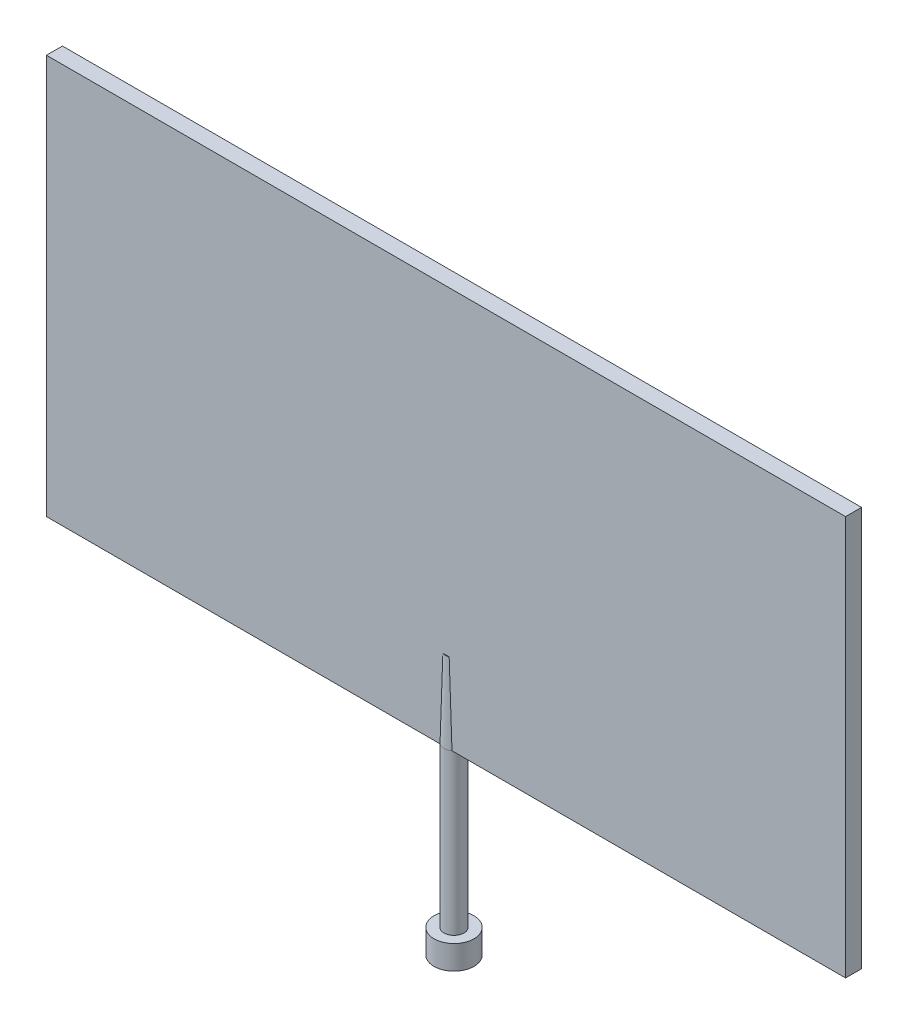
ISO-10303-21;
HEADER;
FILE_DESCRIPTION(('STEP AP214'),'2;1');
FILE_NAME('part.step','',(''),(''),'','','');
FILE_SCHEMA(('AUTOMOTIVE_DESIGN { 1 0 10303 214 1 1 1 1 }'));
ENDSEC;
DATA;
#1=APPLICATION_CONTEXT('core data for automotive mechanical design processes');
#2=APPLICATION_PROTOCOL_DEFINITION('international standard','automotive_design',2000,#1);
#3=PRODUCT_CONTEXT('',#1,'mechanical');
#4=PRODUCT('Part','Part','',(#3));
#5=PRODUCT_RELATED_PRODUCT_CATEGORY('part','',(#4));
#6=PRODUCT_DEFINITION_FORMATION('','',#4);
#7=PRODUCT_DEFINITION_CONTEXT('part definition',#1,'design');
#8=PRODUCT_DEFINITION('design','',#6,#7);
#9=PRODUCT_DEFINITION_SHAPE('','',#8);
#10=(LENGTH_UNIT() NAMED_UNIT(*) SI_UNIT(.MILLI.,.METRE.));
#11=(NAMED_UNIT(*) PLANE_ANGLE_UNIT() SI_UNIT($,.RADIAN.));
#12=(NAMED_UNIT(*) SI_UNIT($,.STERADIAN.) SOLID_ANGLE_UNIT());
#13=UNCERTAINTY_MEASURE_WITH_UNIT(LENGTH_MEASURE(1.E-05),#10,'distance_accuracy_value','');
#14=(GEOMETRIC_REPRESENTATION_CONTEXT(3) GLOBAL_UNCERTAINTY_ASSIGNED_CONTEXT((#13)) GLOBAL_UNIT_ASSIGNED_CONTEXT((#10,
#11,#12)) REPRESENTATION_CONTEXT('',''));
#15=CARTESIAN_POINT('',(0.,0.,0.));
#16=DIRECTION('',(0.,0.,1.));
#17=DIRECTION('',(1.,0.,0.));
#18=AXIS2_PLACEMENT_3D('',#15,#16,#17);
#19=CARTESIAN_POINT('',(-26.25,-23.,-13.375));
#20=DIRECTION('',(0.,-1.,0.));
#21=DIRECTION('',(0.,0.,-1.));
#22=AXIS2_PLACEMENT_3D('',#19,#20,#21);
#23=PLANE('',#22);
#24=CARTESIAN_POINT('',(-26.25,-23.,-13.375));
#25=DIRECTION('',(0.,-1.,0.));
#26=DIRECTION('',(0.,0.,-1.));
#27=AXIS2_PLACEMENT_3D('',#24,#25,#26);
#28=CIRCLE('',#27,2.49900126422122);
#29=CARTESIAN_POINT('',(-26.25,-23.,-10.8759987357788));
#30=VERTEX_POINT('',#29);
#31=EDGE_CURVE('E11',#30,#30,#28,.T.);
#32=ORIENTED_EDGE('',*,*,#31,.T.);
#33=EDGE_LOOP('',(#32));
#34=FACE_BOUND('',#33,.T.);
#35=CARTESIAN_POINT('',(-26.25,-23.,-13.375));
#36=DIRECTION('',(0.,-1.,0.));
#37=DIRECTION('',(0.,0.,-1.));
#38=AXIS2_PLACEMENT_3D('',#35,#36,#37);
#39=CIRCLE('',#38,1.25);
#40=CARTESIAN_POINT('',(-26.25,-23.,-12.125));
#41=VERTEX_POINT('',#40);
#42=EDGE_CURVE('E52',#41,#41,#39,.T.);
#43=ORIENTED_EDGE('',*,*,#42,.F.);
#44=EDGE_LOOP('',(#43));
#45=FACE_BOUND('',#44,.T.);
#46=ADVANCED_FACE('F41',(#34,#45),#23,.T.);
#47=CARTESIAN_POINT('',(-26.25,-20.,-13.375));
#48=DIRECTION('',(0.,-1.,0.));
#49=DIRECTION('',(0.,0.,-1.));
#50=AXIS2_PLACEMENT_3D('',#47,#48,#49);
#51=PLANE('',#50);
#52=CARTESIAN_POINT('',(-26.25,-20.,-13.375));
#53=DIRECTION('',(0.,-1.,0.));
#54=DIRECTION('',(0.,0.,-1.));
#55=AXIS2_PLACEMENT_3D('',#52,#53,#54);
#56=CIRCLE('',#55,2.49900126422122);
#57=CARTESIAN_POINT('',(-26.25,-20.,-10.8759987357788));
#58=VERTEX_POINT('',#57);
#59=EDGE_CURVE('E45',#58,#58,#56,.T.);
#60=ORIENTED_EDGE('',*,*,#59,.F.);
#61=EDGE_LOOP('',(#60));
#62=FACE_BOUND('',#61,.T.);
#63=CARTESIAN_POINT('',(-26.25,-20.,-13.375));
#64=DIRECTION('',(0.,-1.,0.));
#65=DIRECTION('',(0.,0.,-1.));
#66=AXIS2_PLACEMENT_3D('',#63,#64,#65);
#67=CIRCLE('',#66,1.25);
#68=CARTESIAN_POINT('',(-26.25,-20.,-12.125));
#69=VERTEX_POINT('',#68);
#70=EDGE_CURVE('E54',#69,#69,#67,.T.);
#71=ORIENTED_EDGE('',*,*,#70,.T.);
#72=EDGE_LOOP('',(#71));
#73=FACE_BOUND('',#72,.T.);
#74=ADVANCED_FACE('F64',(#62,#73),#51,.F.);
#75=CARTESIAN_POINT('',(-26.25,-23.,-13.375));
#76=DIRECTION('',(0.,1.,0.));
#77=DIRECTION('',(0.,0.,1.));
#78=AXIS2_PLACEMENT_3D('',#75,#76,#77);
#79=CYLINDRICAL_SURFACE('',#78,2.49900126422122);
#80=CARTESIAN_POINT('',(-26.25,-23.,-10.8759987357788));
#81=CARTESIAN_POINT('',(-26.25,-22.96875,-10.8759987357788));
#82=CARTESIAN_POINT('',(-26.25,-22.9375,-10.8759987357788));
#83=CARTESIAN_POINT('',(-26.25,-22.875,-10.8759987357788));
#84=CARTESIAN_POINT('',(-26.25,-22.84375,-10.8759987357788));
#85=CARTESIAN_POINT('',(-26.25,-22.78125,-10.8759987357788));
#86=CARTESIAN_POINT('',(-26.25,-22.75,-10.8759987357788));
#87=CARTESIAN_POINT('',(-26.25,-22.6875,-10.8759987357788));
#88=CARTESIAN_POINT('',(-26.25,-22.65625,-10.8759987357788));
#89=CARTESIAN_POINT('',(-26.25,-22.59375,-10.8759987357788));
#90=CARTESIAN_POINT('',(-26.25,-22.5625,-10.8759987357788));
#91=CARTESIAN_POINT('',(-26.25,-22.5,-10.8759987357788));
#92=CARTESIAN_POINT('',(-26.25,-22.46875,-10.8759987357788));
#93=CARTESIAN_POINT('',(-26.25,-22.40625,-10.8759987357788));
#94=CARTESIAN_POINT('',(-26.25,-22.375,-10.8759987357788));
#95=CARTESIAN_POINT('',(-26.25,-22.3125,-10.8759987357788));
#96=CARTESIAN_POINT('',(-26.25,-22.28125,-10.8759987357788));
#97=CARTESIAN_POINT('',(-26.25,-22.21875,-10.8759987357788));
#98=CARTESIAN_POINT('',(-26.25,-22.1875,-10.8759987357788));
#99=CARTESIAN_POINT('',(-26.25,-22.125,-10.8759987357788));
#100=CARTESIAN_POINT('',(-26.25,-22.09375,-10.8759987357788));
#101=CARTESIAN_POINT('',(-26.25,-22.03125,-10.8759987357788));
#102=CARTESIAN_POINT('',(-26.25,-22.,-10.8759987357788));
#103=CARTESIAN_POINT('',(-26.25,-21.9375,-10.8759987357788));
#104=CARTESIAN_POINT('',(-26.25,-21.90625,-10.8759987357788));
#105=CARTESIAN_POINT('',(-26.25,-21.84375,-10.8759987357788));
#106=CARTESIAN_POINT('',(-26.25,-21.8125,-10.8759987357788));
#107=CARTESIAN_POINT('',(-26.25,-21.75,-10.8759987357788));
#108=CARTESIAN_POINT('',(-26.25,-21.71875,-10.8759987357788));
#109=CARTESIAN_POINT('',(-26.25,-21.65625,-10.8759987357788));
#110=CARTESIAN_POINT('',(-26.25,-21.625,-10.8759987357788));
#111=CARTESIAN_POINT('',(-26.25,-21.5625,-10.8759987357788));
#112=CARTESIAN_POINT('',(-26.25,-21.53125,-10.8759987357788));
#113=CARTESIAN_POINT('',(-26.25,-21.46875,-10.8759987357788));
#114=CARTESIAN_POINT('',(-26.25,-21.4375,-10.8759987357788));
#115=CARTESIAN_POINT('',(-26.25,-21.375,-10.8759987357788));
#116=CARTESIAN_POINT('',(-26.25,-21.34375,-10.8759987357788));
#117=CARTESIAN_POINT('',(-26.25,-21.28125,-10.8759987357788));
#118=CARTESIAN_POINT('',(-26.25,-21.25,-10.8759987357788));
#119=CARTESIAN_POINT('',(-26.25,-21.1875,-10.8759987357788));
#120=CARTESIAN_POINT('',(-26.25,-21.15625,-10.8759987357788));
#121=CARTESIAN_POINT('',(-26.25,-21.09375,-10.8759987357788));
#122=CARTESIAN_POINT('',(-26.25,-21.0625,-10.8759987357788));
#123=CARTESIAN_POINT('',(-26.25,-21.,-10.8759987357788));
#124=CARTESIAN_POINT('',(-26.25,-20.96875,-10.8759987357788));
#125=CARTESIAN_POINT('',(-26.25,-20.90625,-10.8759987357788));
#126=CARTESIAN_POINT('',(-26.25,-20.875,-10.8759987357788));
#127=CARTESIAN_POINT('',(-26.25,-20.8125,-10.8759987357788));
#128=CARTESIAN_POINT('',(-26.25,-20.78125,-10.8759987357788));
#129=CARTESIAN_POINT('',(-26.25,-20.71875,-10.8759987357788));
#130=CARTESIAN_POINT('',(-26.25,-20.6875,-10.8759987357788));
#131=CARTESIAN_POINT('',(-26.25,-20.625,-10.8759987357788));
#132=CARTESIAN_POINT('',(-26.25,-20.59375,-10.8759987357788));
#133=CARTESIAN_POINT('',(-26.25,-20.53125,-10.8759987357788));
#134=CARTESIAN_POINT('',(-26.25,-20.5,-10.8759987357788));
#135=CARTESIAN_POINT('',(-26.25,-20.4375,-10.8759987357788));
#136=CARTESIAN_POINT('',(-26.25,-20.40625,-10.8759987357788));
#137=CARTESIAN_POINT('',(-26.25,-20.34375,-10.8759987357788));
#138=CARTESIAN_POINT('',(-26.25,-20.3125,-10.8759987357788));
#139=CARTESIAN_POINT('',(-26.25,-20.25,-10.8759987357788));
#140=CARTESIAN_POINT('',(-26.25,-20.21875,-10.8759987357788));
#141=CARTESIAN_POINT('',(-26.25,-20.15625,-10.8759987357788));
#142=CARTESIAN_POINT('',(-26.25,-20.125,-10.8759987357788));
#143=CARTESIAN_POINT('',(-26.25,-20.0625,-10.8759987357788));
#144=CARTESIAN_POINT('',(-26.25,-20.03125,-10.8759987357788));
#145=CARTESIAN_POINT('',(-26.25,-20.,-10.8759987357788));
#146=B_SPLINE_CURVE_WITH_KNOTS('',3,(#80,#81,#82,#83,#84,#85,#86,#87,#88,#89,#90,#91,#92,#93,
#94,#95,#96,#97,#98,#99,#100,#101,#102,#103,#104,#105,#106,#107,#108,#109,#110,#111,#112,#113,
#114,#115,#116,#117,#118,#119,#120,#121,#122,#123,#124,#125,#126,#127,#128,#129,#130,#131,#132,
#133,#134,#135,#136,#137,#138,#139,#140,#141,#142,#143,#144,#145),.UNSPECIFIED.,.F.,.F.,(4,2,2,
2,2,2,2,2,2,2,2,2,2,2,2,2,2,2,2,2,2,2,2,2,2,2,2,2,2,2,2,2,4),(0.,0.0937500000000001,0.1875,
0.28125,0.375,0.46875,0.5625,0.656249999999997,0.749999999999997,0.843749999999997,
0.937499999999997,1.03125,1.125,1.21874999999999,1.31249999999999,1.40624999999999,
1.49999999999999,1.59374999999999,1.68749999999999,1.78124999999999,1.87499999999999,
1.96874999999999,2.06249999999999,2.15624999999999,2.24999999999999,2.34374999999999,
2.43749999999999,2.53124999999999,2.62499999999999,2.71874999999999,2.81249999999999,
2.90624999999999,2.99999999999999),.UNSPECIFIED.);
#147=EDGE_CURVE('BSEAM43',#30,#58,#146,.T.);
#148=ORIENTED_EDGE('',*,*,#31,.F.);
#149=ORIENTED_EDGE('',*,*,#59,.T.);
#150=ORIENTED_EDGE('',*,*,#147,.T.);
#151=ORIENTED_EDGE('',*,*,#147,.F.);
#152=EDGE_LOOP('',(#148,#150,#149,#151));
#153=FACE_BOUND('',#152,.T.);
#154=ADVANCED_FACE('F43',(#153),#79,.T.);
#155=CARTESIAN_POINT('',(-26.25,-23.,-13.375));
#156=DIRECTION('',(0.,1.,0.));
#157=DIRECTION('',(0.,0.,1.));
#158=AXIS2_PLACEMENT_3D('',#155,#156,#157);
#159=CYLINDRICAL_SURFACE('',#158,1.25);
#160=CARTESIAN_POINT('',(-26.25,-23.,-12.125));
#161=CARTESIAN_POINT('',(-26.25,-22.96875,-12.125));
#162=CARTESIAN_POINT('',(-26.25,-22.9375,-12.125));
#163=CARTESIAN_POINT('',(-26.25,-22.875,-12.125));
#164=CARTESIAN_POINT('',(-26.25,-22.84375,-12.125));
#165=CARTESIAN_POINT('',(-26.25,-22.78125,-12.125));
#166=CARTESIAN_POINT('',(-26.25,-22.75,-12.125));
#167=CARTESIAN_POINT('',(-26.25,-22.6875,-12.125));
#168=CARTESIAN_POINT('',(-26.25,-22.65625,-12.125));
#169=CARTESIAN_POINT('',(-26.25,-22.59375,-12.125));
#170=CARTESIAN_POINT('',(-26.25,-22.5625,-12.125));
#171=CARTESIAN_POINT('',(-26.25,-22.5,-12.125));
#172=CARTESIAN_POINT('',(-26.25,-22.46875,-12.125));
#173=CARTESIAN_POINT('',(-26.25,-22.40625,-12.125));
#174=CARTESIAN_POINT('',(-26.25,-22.375,-12.125));
#175=CARTESIAN_POINT('',(-26.25,-22.3125,-12.125));
#176=CARTESIAN_POINT('',(-26.25,-22.28125,-12.125));
#177=CARTESIAN_POINT('',(-26.25,-22.21875,-12.125));
#178=CARTESIAN_POINT('',(-26.25,-22.1875,-12.125));
#179=CARTESIAN_POINT('',(-26.25,-22.125,-12.125));
#180=CARTESIAN_POINT('',(-26.25,-22.09375,-12.125));
#181=CARTESIAN_POINT('',(-26.25,-22.03125,-12.125));
#182=CARTESIAN_POINT('',(-26.25,-22.,-12.125));
#183=CARTESIAN_POINT('',(-26.25,-21.9375,-12.125));
#184=CARTESIAN_POINT('',(-26.25,-21.90625,-12.125));
#185=CARTESIAN_POINT('',(-26.25,-21.84375,-12.125));
#186=CARTESIAN_POINT('',(-26.25,-21.8125,-12.125));
#187=CARTESIAN_POINT('',(-26.25,-21.75,-12.125));
#188=CARTESIAN_POINT('',(-26.25,-21.71875,-12.125));
#189=CARTESIAN_POINT('',(-26.25,-21.65625,-12.125));
#190=CARTESIAN_POINT('',(-26.25,-21.625,-12.125));
#191=CARTESIAN_POINT('',(-26.25,-21.5625,-12.125));
#192=CARTESIAN_POINT('',(-26.25,-21.53125,-12.125));
#193=CARTESIAN_POINT('',(-26.25,-21.46875,-12.125));
#194=CARTESIAN_POINT('',(-26.25,-21.4375,-12.125));
#195=CARTESIAN_POINT('',(-26.25,-21.375,-12.125));
#196=CARTESIAN_POINT('',(-26.25,-21.34375,-12.125));
#197=CARTESIAN_POINT('',(-26.25,-21.28125,-12.125));
#198=CARTESIAN_POINT('',(-26.25,-21.25,-12.125));
#199=CARTESIAN_POINT('',(-26.25,-21.1875,-12.125));
#200=CARTESIAN_POINT('',(-26.25,-21.15625,-12.125));
#201=CARTESIAN_POINT('',(-26.25,-21.09375,-12.125));
#202=CARTESIAN_POINT('',(-26.25,-21.0625,-12.125));
#203=CARTESIAN_POINT('',(-26.25,-21.,-12.125));
#204=CARTESIAN_POINT('',(-26.25,-20.96875,-12.125));
#205=CARTESIAN_POINT('',(-26.25,-20.90625,-12.125));
#206=CARTESIAN_POINT('',(-26.25,-20.875,-12.125));
#207=CARTESIAN_POINT('',(-26.25,-20.8125,-12.125));
#208=CARTESIAN_POINT('',(-26.25,-20.78125,-12.125));
#209=CARTESIAN_POINT('',(-26.25,-20.71875,-12.125));
#210=CARTESIAN_POINT('',(-26.25,-20.6875,-12.125));
#211=CARTESIAN_POINT('',(-26.25,-20.625,-12.125));
#212=CARTESIAN_POINT('',(-26.25,-20.59375,-12.125));
#213=CARTESIAN_POINT('',(-26.25,-20.53125,-12.125));
#214=CARTESIAN_POINT('',(-26.25,-20.5,-12.125));
#215=CARTESIAN_POINT('',(-26.25,-20.4375,-12.125));
#216=CARTESIAN_POINT('',(-26.25,-20.40625,-12.125));
#217=CARTESIAN_POINT('',(-26.25,-20.34375,-12.125));
#218=CARTESIAN_POINT('',(-26.25,-20.3125,-12.125));
#219=CARTESIAN_POINT('',(-26.25,-20.25,-12.125));
#220=CARTESIAN_POINT('',(-26.25,-20.21875,-12.125));
#221=CARTESIAN_POINT('',(-26.25,-20.15625,-12.125));
#222=CARTESIAN_POINT('',(-26.25,-20.125,-12.125));
#223=CARTESIAN_POINT('',(-26.25,-20.0625,-12.125));
#224=CARTESIAN_POINT('',(-26.25,-20.03125,-12.125));
#225=CARTESIAN_POINT('',(-26.25,-20.,-12.125));
#226=B_SPLINE_CURVE_WITH_KNOTS('',3,(#160,#161,#162,#163,#164,#165,#166,#167,#168,#169,#170,
#171,#172,#173,#174,#175,#176,#177,#178,#179,#180,#181,#182,#183,#184,#185,#186,#187,#188,#189,
#190,#191,#192,#193,#194,#195,#196,#197,#198,#199,#200,#201,#202,#203,#204,#205,#206,#207,#208,
#209,#210,#211,#212,#213,#214,#215,#216,#217,#218,#219,#220,#221,#222,#223,#224,#225),
.UNSPECIFIED.,.F.,.F.,(4,2,2,2,2,2,2,2,2,2,2,2,2,2,2,2,2,2,2,2,2,2,2,2,2,2,2,2,2,2,2,2,4),(0.,
0.0937499999999966,0.187499999999997,0.281249999999997,0.374999999999997,0.468749999999997,
0.562499999999997,0.656249999999994,0.749999999999994,0.843749999999994,0.937499999999994,
1.03124999999999,1.12499999999999,1.21874999999999,1.31249999999999,1.40624999999999,
1.49999999999999,1.59374999999999,1.68749999999999,1.78124999999999,1.87499999999999,
1.96874999999999,2.06249999999999,2.15624999999999,2.24999999999999,2.34374999999999,
2.43749999999999,2.53124999999998,2.62499999999998,2.71874999999998,2.81249999999999,
2.90624999999999,2.99999999999999),.UNSPECIFIED.);
#227=EDGE_CURVE('BSEAM60',#41,#69,#226,.T.);
#228=ORIENTED_EDGE('',*,*,#42,.T.);
#229=ORIENTED_EDGE('',*,*,#70,.F.);
#230=ORIENTED_EDGE('',*,*,#227,.T.);
#231=ORIENTED_EDGE('',*,*,#227,.F.);
#232=EDGE_LOOP('',(#228,#230,#229,#231));
#233=FACE_BOUND('',#232,.T.);
#234=ADVANCED_FACE('F60',(#233),#159,.F.);
#235=CLOSED_SHELL('',(#46,#74,#154,#234));
#236=MANIFOLD_SOLID_BREP('B2',#235);
#237=CARTESIAN_POINT('',(0.,0.,0.));
#238=DIRECTION('',(0.,1.,0.));
#239=DIRECTION('',(0.,0.,1.));
#240=AXIS2_PLACEMENT_3D('',#237,#238,#239);
#241=PLANE('',#240);
#242=CARTESIAN_POINT('',(-26.25,0.,-13.375));
#243=DIRECTION('',(0.,-1.,0.));
#244=DIRECTION('',(0.,0.,-1.));
#245=AXIS2_PLACEMENT_3D('',#242,#243,#244);
#246=CIRCLE('',#245,1.25);
#247=CARTESIAN_POINT('',(-25.5,0.,-14.375));
#248=VERTEX_POINT('',#247);
#249=CARTESIAN_POINT('',(-25.5,0.,-12.375));
#250=VERTEX_POINT('',#249);
#251=EDGE_CURVE('E113',#248,#250,#246,.T.);
#252=ORIENTED_EDGE('',*,*,#251,.F.);
#253=DIRECTION('',(-1.,0.,0.));
#254=VECTOR('',#253,1.);
#255=CARTESIAN_POINT('',(-76.2500000000001,0.,-14.375));
#256=LINE('',#255,#254);
#257=CARTESIAN_POINT('',(23.75,0.,-14.375));
#258=VERTEX_POINT('',#257);
#259=EDGE_CURVE('E185',#258,#248,#256,.T.);
#260=ORIENTED_EDGE('',*,*,#259,.F.);
#261=DIRECTION('',(0.,0.,-1.));
#262=VECTOR('',#261,1.);
#263=CARTESIAN_POINT('',(23.75,0.,-14.375));
#264=LINE('',#263,#262);
#265=CARTESIAN_POINT('',(23.75,0.,-12.375));
#266=VERTEX_POINT('',#265);
#267=EDGE_CURVE('E254',#266,#258,#264,.T.);
#268=ORIENTED_EDGE('',*,*,#267,.F.);
#269=DIRECTION('',(1.,0.,0.));
#270=VECTOR('',#269,1.);
#271=CARTESIAN_POINT('',(-76.2500000000001,0.,-12.375));
#272=LINE('',#271,#270);
#273=EDGE_CURVE('E197',#250,#266,#272,.T.);
#274=ORIENTED_EDGE('',*,*,#273,.F.);
#275=EDGE_LOOP('',(#252,#260,#268,#274));
#276=FACE_BOUND('',#275,.T.);
#277=ADVANCED_FACE('F103',(#276),#241,.F.);
#278=CARTESIAN_POINT('',(-27.0000000000001,0.,-12.375));
#279=VERTEX_POINT('',#278);
#280=CARTESIAN_POINT('',(-27.0000000000001,0.,-14.375));
#281=VERTEX_POINT('',#280);
#282=EDGE_CURVE('E39',#279,#281,#246,.T.);
#283=ORIENTED_EDGE('',*,*,#282,.F.);
#284=CARTESIAN_POINT('',(-76.2500000000001,0.,-12.375));
#285=VERTEX_POINT('',#284);
#286=EDGE_CURVE('E249',#285,#279,#272,.T.);
#287=ORIENTED_EDGE('',*,*,#286,.F.);
#288=DIRECTION('',(0.,0.,1.));
#289=VECTOR('',#288,1.);
#290=CARTESIAN_POINT('',(-76.2500000000001,0.,-14.375));
#291=LINE('',#290,#289);
#292=CARTESIAN_POINT('',(-76.2500000000001,0.,-14.375));
#293=VERTEX_POINT('',#292);
#294=EDGE_CURVE('E259',#293,#285,#291,.T.);
#295=ORIENTED_EDGE('',*,*,#294,.F.);
#296=EDGE_CURVE('E194',#281,#293,#256,.T.);
#297=ORIENTED_EDGE('',*,*,#296,.F.);
#298=EDGE_LOOP('',(#283,#287,#295,#297));
#299=FACE_BOUND('',#298,.T.);
#300=ADVANCED_FACE('F238',(#299),#241,.F.);
#301=CARTESIAN_POINT('',(-76.2500000000001,50.,-14.375));
#302=DIRECTION('',(1.,0.,0.));
#303=DIRECTION('',(0.,0.,-1.));
#304=AXIS2_PLACEMENT_3D('',#301,#302,#303);
#305=PLANE('',#304);
#306=ORIENTED_EDGE('',*,*,#294,.T.);
#307=DIRECTION('',(0.,-1.,0.));
#308=VECTOR('',#307,1.);
#309=CARTESIAN_POINT('',(-76.2500000000001,50.,-12.375));
#310=LINE('',#309,#308);
#311=CARTESIAN_POINT('',(-76.2500000000001,50.,-12.375));
#312=VERTEX_POINT('',#311);
#313=EDGE_CURVE('E252',#312,#285,#310,.T.);
#314=ORIENTED_EDGE('',*,*,#313,.F.);
#315=DIRECTION('',(0.,0.,1.));
#316=VECTOR('',#315,1.);
#317=CARTESIAN_POINT('',(-76.2500000000001,50.,-14.375));
#318=LINE('',#317,#316);
#319=CARTESIAN_POINT('',(-76.2500000000001,50.,-14.375));
#320=VERTEX_POINT('',#319);
#321=EDGE_CURVE('E193',#320,#312,#318,.T.);
#322=ORIENTED_EDGE('',*,*,#321,.F.);
#323=DIRECTION('',(0.,-1.,0.));
#324=VECTOR('',#323,1.);
#325=CARTESIAN_POINT('',(-76.2500000000001,50.,-14.375));
#326=LINE('',#325,#324);
#327=EDGE_CURVE('E275',#320,#293,#326,.T.);
#328=ORIENTED_EDGE('',*,*,#327,.T.);
#329=EDGE_LOOP('',(#306,#314,#322,#328));
#330=FACE_BOUND('',#329,.T.);
#331=ADVANCED_FACE('F105',(#330),#305,.F.);
#332=CARTESIAN_POINT('',(-76.2500000000001,50.,-12.375));
#333=DIRECTION('',(0.,0.,-1.));
#334=DIRECTION('',(-1.,0.,0.));
#335=AXIS2_PLACEMENT_3D('',#332,#333,#334);
#336=PLANE('',#335);
#337=ORIENTED_EDGE('',*,*,#286,.T.);
#338=CARTESIAN_POINT('',(-27.1687205781353,-6.18485843842663,-12.375));
#339=CARTESIAN_POINT('',(-27.1572457720442,-5.74012803796919,-12.375));
#340=CARTESIAN_POINT('',(-27.1456558741414,-5.29540060542335,-12.375));
#341=CARTESIAN_POINT('',(-27.1222135281129,-4.40593327694475,-12.375));
#342=CARTESIAN_POINT('',(-27.1103610685722,-3.961193381313,-12.375));
#343=CARTESIAN_POINT('',(-27.0743618203395,-2.62694898963207,-12.375));
#344=CARTESIAN_POINT('',(-27.049774099369,-1.73745632017803,-12.375));
#345=CARTESIAN_POINT('',(-26.9990617166017,0.0414898374584639,-12.375));
#346=CARTESIAN_POINT('',(-26.9729370473522,0.930943325429998,-12.375));
#347=CARTESIAN_POINT('',(-26.9185729650504,2.70969839054924,-12.375));
#348=CARTESIAN_POINT('',(-26.8903337602323,3.59899997403398,-12.375));
#349=CARTESIAN_POINT('',(-26.8307822875554,5.37748727974656,-12.375));
#350=CARTESIAN_POINT('',(-26.7994700731181,6.26667300371954,-12.375));
#351=CARTESIAN_POINT('',(-26.7486619616576,7.60027059169574,-12.375));
#352=CARTESIAN_POINT('',(-26.7310867461012,8.04475502455244,-12.375));
#353=CARTESIAN_POINT('',(-26.6941329839618,8.93366811669171,-12.375));
#354=CARTESIAN_POINT('',(-26.6747543606252,9.37809677279358,-12.375));
#355=CARTESIAN_POINT('',(-26.6333611286235,10.2670264567576,-12.375));
#356=CARTESIAN_POINT('',(-26.6113453952525,10.7115274341764,-12.375));
#357=CARTESIAN_POINT('',(-26.5748996700778,11.378072932328,-12.375));
#358=CARTESIAN_POINT('',(-26.5621813751306,11.6002106764609,-12.375));
#359=CARTESIAN_POINT('',(-26.5351010773335,12.0443852288148,-12.375));
#360=CARTESIAN_POINT('',(-26.5207391029635,12.2664220387179,-12.375));
#361=CARTESIAN_POINT('',(-26.4972134619118,12.5993895258079,-12.375));
#362=CARTESIAN_POINT('',(-26.4890389765572,12.7103901929495,-12.375));
#363=CARTESIAN_POINT('',(-26.4717910260271,12.9323380004151,-12.375));
#364=CARTESIAN_POINT('',(-26.4627174497821,13.0432851324201,-12.375));
#365=CARTESIAN_POINT('',(-26.4432557443884,13.2649728001661,-12.375));
#366=CARTESIAN_POINT('',(-26.4328686444803,13.3757134295106,-12.375));
#367=CARTESIAN_POINT('',(-26.4100762480076,13.5969854213565,-12.375));
#368=CARTESIAN_POINT('',(-26.3976714982933,13.707516832374,-12.375));
#369=CARTESIAN_POINT('',(-26.3757155018769,13.8728701042804,-12.375));
#370=CARTESIAN_POINT('',(-26.3678365838261,13.9279259807939,-12.375));
#371=CARTESIAN_POINT('',(-26.3502479097614,14.0378783748235,-12.375));
#372=CARTESIAN_POINT('',(-26.3405362179684,14.0927746609578,-12.375));
#373=CARTESIAN_POINT('',(-26.3231993650746,14.169800729209,-12.375));
#374=CARTESIAN_POINT('',(-26.317643292244,14.1924266342772,-12.375));
#375=CARTESIAN_POINT('',(-26.3049863388394,14.2373740478944,-12.375));
#376=CARTESIAN_POINT('',(-26.2978865274987,14.2596957558228,-12.375));
#377=CARTESIAN_POINT('',(-26.2856787452589,14.2861755842278,-12.375));
#378=CARTESIAN_POINT('',(-26.2830516050037,14.29143388703,-12.375));
#379=CARTESIAN_POINT('',(-26.2771832596001,14.3015931431178,-12.375));
#380=CARTESIAN_POINT('',(-26.2739466565513,14.3064964159853,-12.375));
#381=CARTESIAN_POINT('',(-26.2688695850172,14.3123332101577,-12.375));
#382=CARTESIAN_POINT('',(-26.2675581615782,14.3137151462557,-12.375));
#383=CARTESIAN_POINT('',(-26.2647675872728,14.3163003006946,-12.375));
#384=CARTESIAN_POINT('',(-26.2632887642886,14.3175038580939,-12.375));
#385=CARTESIAN_POINT('',(-26.2607049977186,14.3192366096142,-12.375));
#386=CARTESIAN_POINT('',(-26.2596587007421,14.3198521476323,-12.375));
#387=CARTESIAN_POINT('',(-26.2574850048949,14.3209192701989,-12.375));
#388=CARTESIAN_POINT('',(-26.2563577424195,14.3213711230755,-12.375));
#389=CARTESIAN_POINT('',(-26.2542260619849,14.3220058528889,-12.375));
#390=CARTESIAN_POINT('',(-26.2532312333363,14.3222203979362,-12.375));
#391=CARTESIAN_POINT('',(-26.2512196708027,14.322476681499,-12.375));
#392=CARTESIAN_POINT('',(-26.250202956647,14.3225185696015,-12.375));
#393=CARTESIAN_POINT('',(-26.2481781144555,14.3224247075534,-12.375));
#394=CARTESIAN_POINT('',(-26.2471699855445,14.322288975729,-12.375));
#395=CARTESIAN_POINT('',(-26.2451891495567,14.3218556555018,-12.375));
#396=CARTESIAN_POINT('',(-26.2442164835519,14.3215578854107,-12.375));
#397=CARTESIAN_POINT('',(-26.2419176294,14.3206716580114,-12.375));
#398=CARTESIAN_POINT('',(-26.2406186848901,14.3200133055515,-12.375));
#399=CARTESIAN_POINT('',(-26.2381382927699,14.3185044395413,-12.375));
#400=CARTESIAN_POINT('',(-26.2369571743512,14.3176534081988,-12.375));
#401=CARTESIAN_POINT('',(-26.2336979207783,14.3150096670198,-12.375));
#402=CARTESIAN_POINT('',(-26.231755505289,14.3130522527605,-12.375));
#403=CARTESIAN_POINT('',(-26.2281453613429,14.3089011571283,-12.375));
#404=CARTESIAN_POINT('',(-26.2264785994179,14.3067066872252,-12.375));
#405=CARTESIAN_POINT('',(-26.2192573048617,14.2963681228522,-12.375));
#406=CARTESIAN_POINT('',(-26.2147820159727,14.2874984399532,-12.375));
#407=CARTESIAN_POINT('',(-26.2067630125964,14.2693582620336,-12.375));
#408=CARTESIAN_POINT('',(-26.2032258210377,14.2600854569117,-12.375));
#409=CARTESIAN_POINT('',(-26.1869249150803,14.2137759571911,-12.375));
#410=CARTESIAN_POINT('',(-26.1777174527202,14.1755140574154,-12.375));
#411=CARTESIAN_POINT('',(-26.1612813037274,14.0988081963478,-12.375));
#412=CARTESIAN_POINT('',(-26.1540494789275,14.0603646236327,-12.375));
#413=CARTESIAN_POINT('',(-26.1341990444824,13.9450642396079,-12.375));
#414=CARTESIAN_POINT('',(-26.1233388524001,13.867871318466,-12.375));
#415=CARTESIAN_POINT('',(-26.1034871101891,13.7132458633088,-12.375));
#416=CARTESIAN_POINT('',(-26.0944969217931,13.6358131960634,-12.375));
#417=CARTESIAN_POINT('',(-26.0777461240859,13.480773258628,-12.375));
#418=CARTESIAN_POINT('',(-26.0699860005245,13.4031659316739,-12.375));
#419=CARTESIAN_POINT('',(-26.0552784677271,13.2479035145257,-12.375));
#420=CARTESIAN_POINT('',(-26.0483308047401,13.1702484469002,-12.375));
#421=CARTESIAN_POINT('',(-26.0283950068091,12.9374364449445,-12.375));
#422=CARTESIAN_POINT('',(-26.0162908909281,12.7822032529522,-12.375));
#423=CARTESIAN_POINT('',(-25.9935309968533,12.4716299648416,-12.375));
#424=CARTESIAN_POINT('',(-25.9828752623455,12.3162898656406,-12.375));
#425=CARTESIAN_POINT('',(-25.9524046531635,11.8501134971175,-12.375));
#426=CARTESIAN_POINT('',(-25.9340909346252,11.5391794132491,-12.375));
#427=CARTESIAN_POINT('',(-25.8997625229725,10.9173004732886,-12.375));
#428=CARTESIAN_POINT('',(-25.8837470134518,10.6063556604656,-12.375));
#429=CARTESIAN_POINT('',(-25.8532906328565,9.98441672850363,-12.375));
#430=CARTESIAN_POINT('',(-25.8388496225805,9.67342261616168,-12.375));
#431=CARTESIAN_POINT('',(-25.7962192563291,8.71836097500881,-12.375));
#432=CARTESIAN_POINT('',(-25.7698655925321,8.07421223827704,-12.375));
#433=CARTESIAN_POINT('',(-25.7200024302787,6.785803405476,-12.375));
#434=CARTESIAN_POINT('',(-25.6964929510196,6.14154330868447,-12.375));
#435=CARTESIAN_POINT('',(-25.6514291556668,4.85292328630091,-12.375));
#436=CARTESIAN_POINT('',(-25.6298749358436,4.20856335735645,-12.375));
#437=CARTESIAN_POINT('',(-25.5881922066089,2.91979720754052,-12.375));
#438=CARTESIAN_POINT('',(-25.5680636985227,2.27539098662658,-12.375));
#439=CARTESIAN_POINT('',(-25.509292698,0.342066723655875,-12.375));
#440=CARTESIAN_POINT('',(-25.4722666389387,-0.946900330843448,-12.375));
#441=CARTESIAN_POINT('',(-25.4009667505722,-3.52489008702555,-12.375));
#442=CARTESIAN_POINT('',(-25.3666928801728,-4.8139127875898,-12.375));
#443=CARTESIAN_POINT('',(-25.3326885262494,-6.13025975952267,-12.375));
#444=CARTESIAN_POINT('',(-25.3319837573785,-6.15755909343923,-12.375));
#445=CARTESIAN_POINT('',(-25.3312794218643,-6.18485843842661,-12.375));
#446=B_SPLINE_CURVE_WITH_KNOTS('',3,(#338,#339,#340,#341,#342,#343,#344,#345,#346,#347,#348,
#349,#350,#351,#352,#353,#354,#355,#356,#357,#358,#359,#360,#361,#362,#363,#364,#365,#366,#367,
#368,#369,#370,#371,#372,#373,#374,#375,#376,#377,#378,#379,#380,#381,#382,#383,#384,#385,#386,
#387,#388,#389,#390,#391,#392,#393,#394,#395,#396,#397,#398,#399,#400,#401,#402,#403,#404,#405,
#406,#407,#408,#409,#410,#411,#412,#413,#414,#415,#416,#417,#418,#419,#420,#421,#422,#423,#424,
#425,#426,#427,#428,#429,#430,#431,#432,#433,#434,#435,#436,#437,#438,#439,#440,#441,#442,#443,
#444,#445),.UNSPECIFIED.,.F.,.F.,(4,2,2,2,2,2,2,2,2,2,2,2,2,2,2,2,2,2,2,2,2,2,2,2,2,2,2,2,2,2,2,
2,2,2,2,2,2,2,2,2,2,2,2,2,2,2,2,2,2,2,2,2,2,4),(0.,1.33463521008337,2.66932855844927,
5.33882488531535,8.00833415766538,10.6775808881818,13.3467812244872,14.681273710393,
16.0158230187524,17.350943541737,18.0184451194339,18.6859351331386,19.019837419487,
19.3537810060936,19.6874645266341,20.0210577580708,20.1879279948543,20.3549754768285,
20.4249125626449,20.4948013616678,20.5124266681688,20.5299238658298,20.5356295527232,
20.5413242513089,20.5449558348537,20.5485814379342,20.5516210982056,20.5546581244141,
20.5576948372974,20.560734962184,20.5650786317607,20.5694341157701,20.577660556232,
20.585915256312,20.6154934282809,20.6452721740065,20.7628779711465,20.8802958585991,
21.1140024384103,21.3478786116249,21.5818469131438,21.8157419444422,22.2828402024223,
22.7499525458923,23.6843525218338,24.6184197393127,25.5524043088938,27.4864547445676,
29.420518233666,31.35467689796,33.2888373603508,37.1573281441125,41.0257611549803,
41.1076864439923),.UNSPECIFIED.);
#447=CARTESIAN_POINT('',(-26.6457161937038,10.,-12.375));
#448=VERTEX_POINT('',#447);
#449=EDGE_CURVE('E120',#279,#448,#446,.T.);
#450=ORIENTED_EDGE('',*,*,#449,.T.);
#451=DIRECTION('',(-1.,0.,0.));
#452=VECTOR('',#451,1.);
#453=CARTESIAN_POINT('',(-76.2500000000001,9.99999999999999,-12.375));
#454=LINE('',#453,#452);
#455=CARTESIAN_POINT('',(-25.8542838062963,10.,-12.375));
#456=VERTEX_POINT('',#455);
#457=EDGE_CURVE('E124',#456,#448,#454,.T.);
#458=ORIENTED_EDGE('',*,*,#457,.F.);
#459=EDGE_CURVE('E180',#456,#250,#446,.T.);
#460=ORIENTED_EDGE('',*,*,#459,.T.);
#461=ORIENTED_EDGE('',*,*,#273,.T.);
#462=DIRECTION('',(0.,-1.,0.));
#463=VECTOR('',#462,1.);
#464=CARTESIAN_POINT('',(23.75,50.,-12.375));
#465=LINE('',#464,#463);
#466=CARTESIAN_POINT('',(23.75,50.,-12.375));
#467=VERTEX_POINT('',#466);
#468=EDGE_CURVE('E271',#467,#266,#465,.T.);
#469=ORIENTED_EDGE('',*,*,#468,.F.);
#470=DIRECTION('',(1.,0.,0.));
#471=VECTOR('',#470,1.);
#472=CARTESIAN_POINT('',(-76.2500000000001,50.,-12.375));
#473=LINE('',#472,#471);
#474=EDGE_CURVE('E284',#312,#467,#473,.T.);
#475=ORIENTED_EDGE('',*,*,#474,.F.);
#476=ORIENTED_EDGE('',*,*,#313,.T.);
#477=EDGE_LOOP('',(#337,#450,#458,#460,#461,#469,#475,#476));
#478=FACE_BOUND('',#477,.T.);
#479=ADVANCED_FACE('F246',(#478),#336,.F.);
#480=CARTESIAN_POINT('',(23.75,50.,-14.375));
#481=DIRECTION('',(-1.,0.,0.));
#482=DIRECTION('',(0.,0.,1.));
#483=AXIS2_PLACEMENT_3D('',#480,#481,#482);
#484=PLANE('',#483);
#485=ORIENTED_EDGE('',*,*,#267,.T.);
#486=DIRECTION('',(0.,-1.,0.));
#487=VECTOR('',#486,1.);
#488=CARTESIAN_POINT('',(23.75,50.,-14.375));
#489=LINE('',#488,#487);
#490=CARTESIAN_POINT('',(23.75,50.,-14.375));
#491=VERTEX_POINT('',#490);
#492=EDGE_CURVE('E190',#491,#258,#489,.T.);
#493=ORIENTED_EDGE('',*,*,#492,.F.);
#494=DIRECTION('',(0.,0.,-1.));
#495=VECTOR('',#494,1.);
#496=CARTESIAN_POINT('',(23.75,50.,-14.375));
#497=LINE('',#496,#495);
#498=EDGE_CURVE('E282',#467,#491,#497,.T.);
#499=ORIENTED_EDGE('',*,*,#498,.F.);
#500=ORIENTED_EDGE('',*,*,#468,.T.);
#501=EDGE_LOOP('',(#485,#493,#499,#500));
#502=FACE_BOUND('',#501,.T.);
#503=ADVANCED_FACE('F291',(#502),#484,.F.);
#504=CARTESIAN_POINT('',(-76.2500000000001,50.,-14.375));
#505=DIRECTION('',(0.,0.,1.));
#506=DIRECTION('',(1.,0.,0.));
#507=AXIS2_PLACEMENT_3D('',#504,#505,#506);
#508=PLANE('',#507);
#509=ORIENTED_EDGE('',*,*,#259,.T.);
#510=CARTESIAN_POINT('',(-25.3312794218648,-6.18485843842649,-14.375));
#511=CARTESIAN_POINT('',(-25.3427542279559,-5.74012803796906,-14.375));
#512=CARTESIAN_POINT('',(-25.3543441258587,-5.29540060542321,-14.375));
#513=CARTESIAN_POINT('',(-25.3777864718872,-4.40593327694462,-14.375));
#514=CARTESIAN_POINT('',(-25.3896389314279,-3.96119338131286,-14.375));
#515=CARTESIAN_POINT('',(-25.4256381796606,-2.62694898963194,-14.375));
#516=CARTESIAN_POINT('',(-25.4502259006311,-1.7374563201779,-14.375));
#517=CARTESIAN_POINT('',(-25.5009382833984,0.0414898374585946,-14.375));
#518=CARTESIAN_POINT('',(-25.5270629526479,0.930943325430128,-14.375));
#519=CARTESIAN_POINT('',(-25.5814270349498,2.70969839054936,-14.375));
#520=CARTESIAN_POINT('',(-25.6096662397678,3.5989999740341,-14.375));
#521=CARTESIAN_POINT('',(-25.6692177124447,5.37748727974668,-14.375));
#522=CARTESIAN_POINT('',(-25.700529926882,6.26667300371966,-14.375));
#523=CARTESIAN_POINT('',(-25.7513380383425,7.60027059169586,-14.375));
#524=CARTESIAN_POINT('',(-25.7689132538989,8.04475502455255,-14.375));
#525=CARTESIAN_POINT('',(-25.8058670160383,8.93366811669181,-14.375));
#526=CARTESIAN_POINT('',(-25.8252456393749,9.37809677279368,-14.375));
#527=CARTESIAN_POINT('',(-25.8666388713766,10.2670264567577,-14.375));
#528=CARTESIAN_POINT('',(-25.8886546047476,10.7115274341765,-14.375));
#529=CARTESIAN_POINT('',(-25.9251003299223,11.3780729323282,-14.375));
#530=CARTESIAN_POINT('',(-25.9378186248695,11.600210676461,-14.375));
#531=CARTESIAN_POINT('',(-25.9648989226666,12.0443852288149,-14.375));
#532=CARTESIAN_POINT('',(-25.9792608970366,12.266422038718,-14.375));
#533=CARTESIAN_POINT('',(-26.0027865380883,12.599389525808,-14.375));
#534=CARTESIAN_POINT('',(-26.0109610234429,12.7103901929496,-14.375));
#535=CARTESIAN_POINT('',(-26.028208973973,12.9323380004152,-14.375));
#536=CARTESIAN_POINT('',(-26.037282550218,13.0432851324202,-14.375));
#537=CARTESIAN_POINT('',(-26.0567442556117,13.2649728001662,-14.375));
#538=CARTESIAN_POINT('',(-26.0671313555198,13.3757134295108,-14.375));
#539=CARTESIAN_POINT('',(-26.0899237519925,13.5969854213566,-14.375));
#540=CARTESIAN_POINT('',(-26.1023285017068,13.7075168323741,-14.375));
#541=CARTESIAN_POINT('',(-26.1242844981232,13.8728701042805,-14.375));
#542=CARTESIAN_POINT('',(-26.132163416174,13.927925980794,-14.375));
#543=CARTESIAN_POINT('',(-26.1497520902388,14.0378783748236,-14.375));
#544=CARTESIAN_POINT('',(-26.1594637820317,14.0927746609579,-14.375));
#545=CARTESIAN_POINT('',(-26.1768006349255,14.1698007292091,-14.375));
#546=CARTESIAN_POINT('',(-26.1823567077561,14.1924266342773,-14.375));
#547=CARTESIAN_POINT('',(-26.1950136611607,14.2373740478945,-14.375));
#548=CARTESIAN_POINT('',(-26.2021134725014,14.2596957558229,-14.375));
#549=CARTESIAN_POINT('',(-26.2143212547412,14.2861755842279,-14.375));
#550=CARTESIAN_POINT('',(-26.2169483949964,14.2914338870301,-14.375));
#551=CARTESIAN_POINT('',(-26.2228167403999,14.3015931431178,-14.375));
#552=CARTESIAN_POINT('',(-26.2260533434488,14.3064964159853,-14.375));
#553=CARTESIAN_POINT('',(-26.2311304149829,14.3123332101578,-14.375));
#554=CARTESIAN_POINT('',(-26.2324418384219,14.3137151462558,-14.375));
#555=CARTESIAN_POINT('',(-26.2352324127273,14.3163003006947,-14.375));
#556=CARTESIAN_POINT('',(-26.2367112357115,14.317503858094,-14.375));
#557=CARTESIAN_POINT('',(-26.2392950022815,14.3192366096143,-14.375));
#558=CARTESIAN_POINT('',(-26.240341299258,14.3198521476324,-14.375));
#559=CARTESIAN_POINT('',(-26.2425149951052,14.320919270199,-14.375));
#560=CARTESIAN_POINT('',(-26.2436422575806,14.3213711230756,-14.375));
#561=CARTESIAN_POINT('',(-26.2457739380151,14.322005852889,-14.375));
#562=CARTESIAN_POINT('',(-26.2467687666638,14.3222203979363,-14.375));
#563=CARTESIAN_POINT('',(-26.2487803291974,14.3224766814991,-14.375));
#564=CARTESIAN_POINT('',(-26.2497970433531,14.3225185696016,-14.375));
#565=CARTESIAN_POINT('',(-26.2518218855446,14.3224247075535,-14.375));
#566=CARTESIAN_POINT('',(-26.2528300144555,14.3222889757291,-14.375));
#567=CARTESIAN_POINT('',(-26.2548108504434,14.3218556555019,-14.375));
#568=CARTESIAN_POINT('',(-26.2557835164481,14.3215578854108,-14.375));
#569=CARTESIAN_POINT('',(-26.2580823706001,14.3206716580115,-14.375));
#570=CARTESIAN_POINT('',(-26.25938131511,14.3200133055516,-14.375));
#571=CARTESIAN_POINT('',(-26.2618617072302,14.3185044395414,-14.375));
#572=CARTESIAN_POINT('',(-26.2630428256489,14.3176534081989,-14.375));
#573=CARTESIAN_POINT('',(-26.2663020792218,14.3150096670199,-14.375));
#574=CARTESIAN_POINT('',(-26.2682444947111,14.3130522527607,-14.375));
#575=CARTESIAN_POINT('',(-26.2718546386572,14.3089011571285,-14.375));
#576=CARTESIAN_POINT('',(-26.2735214005821,14.3067066872253,-14.375));
#577=CARTESIAN_POINT('',(-26.2807426951383,14.2963681228524,-14.375));
#578=CARTESIAN_POINT('',(-26.2852179840274,14.2874984399535,-14.375));
#579=CARTESIAN_POINT('',(-26.2932369874036,14.2693582620339,-14.375));
#580=CARTESIAN_POINT('',(-26.2967741789623,14.2600854569121,-14.375));
#581=CARTESIAN_POINT('',(-26.3130750849197,14.2137759571916,-14.375));
#582=CARTESIAN_POINT('',(-26.3222825472798,14.1755140574161,-14.375));
#583=CARTESIAN_POINT('',(-26.3387186962725,14.0988081963488,-14.375));
#584=CARTESIAN_POINT('',(-26.3459505210724,14.0603646236339,-14.375));
#585=CARTESIAN_POINT('',(-26.3658009555175,13.9450642396095,-14.375));
#586=CARTESIAN_POINT('',(-26.3766611475997,13.8678713184679,-14.375));
#587=CARTESIAN_POINT('',(-26.3965128898107,13.7132458633113,-14.375));
#588=CARTESIAN_POINT('',(-26.4055030782067,13.6358131960663,-14.375));
#589=CARTESIAN_POINT('',(-26.4222538759139,13.4807732586315,-14.375));
#590=CARTESIAN_POINT('',(-26.4300139994752,13.4031659316777,-14.375));
#591=CARTESIAN_POINT('',(-26.4447215322726,13.24790351453,-14.375));
#592=CARTESIAN_POINT('',(-26.4516691952596,13.1702484469049,-14.375));
#593=CARTESIAN_POINT('',(-26.4716049931905,12.9374364449501,-14.375));
#594=CARTESIAN_POINT('',(-26.4837091090715,12.7822032529584,-14.375));
#595=CARTESIAN_POINT('',(-26.5064690031463,12.471629964849,-14.375));
#596=CARTESIAN_POINT('',(-26.5171247376541,12.3162898656487,-14.375));
#597=CARTESIAN_POINT('',(-26.547595346836,11.8501134971274,-14.375));
#598=CARTESIAN_POINT('',(-26.5659090653742,11.5391794132603,-14.375));
#599=CARTESIAN_POINT('',(-26.6002374770269,10.9173004733022,-14.375));
#600=CARTESIAN_POINT('',(-26.6162529865476,10.6063556604804,-14.375));
#601=CARTESIAN_POINT('',(-26.6467093671428,9.9844167285209,-14.375));
#602=CARTESIAN_POINT('',(-26.6611503774188,9.67342261618017,-14.375));
#603=CARTESIAN_POINT('',(-26.7037807436702,8.71836097502772,-14.375));
#604=CARTESIAN_POINT('',(-26.7301344074673,8.07421223829514,-14.375));
#605=CARTESIAN_POINT('',(-26.7799975697208,6.78580340549248,-14.375));
#606=CARTESIAN_POINT('',(-26.80350704898,6.14154330870014,-14.375));
#607=CARTESIAN_POINT('',(-26.8485708443328,4.85292328631496,-14.375));
#608=CARTESIAN_POINT('',(-26.870125064156,4.20856335736969,-14.375));
#609=CARTESIAN_POINT('',(-26.9118077933908,2.91979720755214,-14.375));
#610=CARTESIAN_POINT('',(-26.931936301477,2.27539098663739,-14.375));
#611=CARTESIAN_POINT('',(-26.9907073019999,0.342066723664254,-14.375));
#612=CARTESIAN_POINT('',(-27.0277333610613,-0.94690033083669,-14.375));
#613=CARTESIAN_POINT('',(-27.0990332494278,-3.52489008702203,-14.375));
#614=CARTESIAN_POINT('',(-27.1333071198272,-4.81391278758789,-14.375));
#615=CARTESIAN_POINT('',(-27.1673114737507,-6.13025975952244,-14.375));
#616=CARTESIAN_POINT('',(-27.1680162426216,-6.15755909343904,-14.375));
#617=CARTESIAN_POINT('',(-27.1687205781358,-6.18485843842648,-14.375));
#618=B_SPLINE_CURVE_WITH_KNOTS('',3,(#510,#511,#512,#513,#514,#515,#516,#517,#518,#519,#520,
#521,#522,#523,#524,#525,#526,#527,#528,#529,#530,#531,#532,#533,#534,#535,#536,#537,#538,#539,
#540,#541,#542,#543,#544,#545,#546,#547,#548,#549,#550,#551,#552,#553,#554,#555,#556,#557,#558,
#559,#560,#561,#562,#563,#564,#565,#566,#567,#568,#569,#570,#571,#572,#573,#574,#575,#576,#577,
#578,#579,#580,#581,#582,#583,#584,#585,#586,#587,#588,#589,#590,#591,#592,#593,#594,#595,#596,
#597,#598,#599,#600,#601,#602,#603,#604,#605,#606,#607,#608,#609,#610,#611,#612,#613,#614,#615,
#616,#617),.UNSPECIFIED.,.F.,.F.,(4,2,2,2,2,2,2,2,2,2,2,2,2,2,2,2,2,2,2,2,2,2,2,2,2,2,2,2,2,2,2,
2,2,2,2,2,2,2,2,2,2,2,2,2,2,2,2,2,2,2,2,2,2,4),(0.,1.33463521008337,2.66932855844926,
5.33882488531534,8.00833415766537,10.6775808881818,13.3467812244871,14.681273710393,
16.0158230187524,17.3509435417369,18.0184451194338,18.6859351331386,19.019837419487,
19.3537810060936,19.6874645266341,20.0210577580707,20.1879279948542,20.3549754768284,
20.4249125626448,20.4948013616677,20.5124266681687,20.5299238658297,20.5356295527231,
20.5413242513088,20.5449558348536,20.5485814379342,20.5516210982056,20.5546581244141,
20.5576948372973,20.5607349621839,20.5650786317606,20.56943411577,20.5776605562319,
20.5859152563119,20.6154934282807,20.6452721740061,20.7628779711457,20.8802958585979,
21.1140024384081,21.3478786116218,21.5818469131398,21.8157419444372,22.2828402024155,
22.7499525458837,23.6843525218215,24.6184197392968,25.5524043088741,27.4864547445503,
29.4205182336512,31.3546768979477,33.2888373603409,37.1573281441074,41.0257611549801,
41.1076864439922),.UNSPECIFIED.);
#619=CARTESIAN_POINT('',(-25.8542838062963,10.,-14.375));
#620=VERTEX_POINT('',#619);
#621=EDGE_CURVE('E170',#248,#620,#618,.T.);
#622=ORIENTED_EDGE('',*,*,#621,.T.);
#623=DIRECTION('',(1.,0.,0.));
#624=VECTOR('',#623,1.);
#625=CARTESIAN_POINT('',(-76.2500000000001,9.99999999999999,-14.375));
#626=LINE('',#625,#624);
#627=CARTESIAN_POINT('',(-26.6457161937038,10.,-14.375));
#628=VERTEX_POINT('',#627);
#629=EDGE_CURVE('E107',#628,#620,#626,.T.);
#630=ORIENTED_EDGE('',*,*,#629,.F.);
#631=EDGE_CURVE('E181',#628,#281,#618,.T.);
#632=ORIENTED_EDGE('',*,*,#631,.T.);
#633=ORIENTED_EDGE('',*,*,#296,.T.);
#634=ORIENTED_EDGE('',*,*,#327,.F.);
#635=DIRECTION('',(-1.,0.,0.));
#636=VECTOR('',#635,1.);
#637=CARTESIAN_POINT('',(-76.2500000000001,50.,-14.375));
#638=LINE('',#637,#636);
#639=EDGE_CURVE('E277',#491,#320,#638,.T.);
#640=ORIENTED_EDGE('',*,*,#639,.F.);
#641=ORIENTED_EDGE('',*,*,#492,.T.);
#642=EDGE_LOOP('',(#509,#622,#630,#632,#633,#634,#640,#641));
#643=FACE_BOUND('',#642,.T.);
#644=ADVANCED_FACE('F187',(#643),#508,.F.);
#645=CARTESIAN_POINT('',(0.,50.,0.));
#646=DIRECTION('',(0.,1.,0.));
#647=DIRECTION('',(0.,0.,1.));
#648=AXIS2_PLACEMENT_3D('',#645,#646,#647);
#649=PLANE('',#648);
#650=ORIENTED_EDGE('',*,*,#321,.T.);
#651=ORIENTED_EDGE('',*,*,#474,.T.);
#652=ORIENTED_EDGE('',*,*,#498,.T.);
#653=ORIENTED_EDGE('',*,*,#639,.T.);
#654=EDGE_LOOP('',(#650,#651,#652,#653));
#655=FACE_BOUND('',#654,.T.);
#656=ADVANCED_FACE('F232',(#655),#649,.T.);
#657=CARTESIAN_POINT('',(-26.25,10.,-13.375));
#658=DIRECTION('',(0.,-1.,0.));
#659=DIRECTION('',(0.,0.,-1.));
#660=AXIS2_PLACEMENT_3D('',#657,#658,#659);
#661=PLANE('',#660);
#662=CARTESIAN_POINT('',(-26.25,10.,-13.375));
#663=DIRECTION('',(0.,-1.,0.));
#664=DIRECTION('',(0.,0.,-1.));
#665=AXIS2_PLACEMENT_3D('',#662,#663,#664);
#666=CIRCLE('',#665,1.07544935071783);
#667=EDGE_CURVE('E177',#628,#620,#666,.T.);
#668=ORIENTED_EDGE('',*,*,#667,.F.);
#669=ORIENTED_EDGE('',*,*,#629,.T.);
#670=EDGE_LOOP('',(#668,#669));
#671=FACE_BOUND('',#670,.T.);
#672=ADVANCED_FACE('F235',(#671),#661,.F.);
#673=CARTESIAN_POINT('',(-26.25,0.,-13.375));
#674=DIRECTION('',(0.,-1.,0.));
#675=DIRECTION('',(0.,0.,-1.));
#676=AXIS2_PLACEMENT_3D('',#673,#674,#675);
#677=CONICAL_SURFACE('',#676,1.25,0.0174532925199433);
#678=ORIENTED_EDGE('',*,*,#621,.F.);
#679=CARTESIAN_POINT('',(-26.25,0.,-13.375));
#680=DIRECTION('',(0.,-1.,0.));
#681=DIRECTION('',(0.,0.,-1.));
#682=AXIS2_PLACEMENT_3D('',#679,#680,#681);
#683=CIRCLE('',#682,1.25);
#684=EDGE_CURVE('E175',#281,#248,#683,.T.);
#685=ORIENTED_EDGE('',*,*,#684,.F.);
#686=ORIENTED_EDGE('',*,*,#631,.F.);
#687=ORIENTED_EDGE('',*,*,#667,.T.);
#688=EDGE_LOOP('',(#678,#685,#686,#687));
#689=FACE_BOUND('',#688,.T.);
#690=ADVANCED_FACE('F172',(#689),#677,.T.);
#691=EDGE_CURVE('E207',#456,#448,#666,.T.);
#692=ORIENTED_EDGE('',*,*,#691,.F.);
#693=ORIENTED_EDGE('',*,*,#457,.T.);
#694=EDGE_LOOP('',(#692,#693));
#695=FACE_BOUND('',#694,.T.);
#696=ADVANCED_FACE('F229',(#695),#661,.F.);
#697=ORIENTED_EDGE('',*,*,#449,.F.);
#698=EDGE_CURVE('E202',#250,#279,#683,.T.);
#699=ORIENTED_EDGE('',*,*,#698,.F.);
#700=ORIENTED_EDGE('',*,*,#459,.F.);
#701=ORIENTED_EDGE('',*,*,#691,.T.);
#702=EDGE_LOOP('',(#697,#699,#700,#701));
#703=FACE_BOUND('',#702,.T.);
#704=ADVANCED_FACE('F224',(#703),#677,.T.);
#705=CARTESIAN_POINT('',(-26.25,-20.,-13.375));
#706=DIRECTION('',(0.,1.,0.));
#707=DIRECTION('',(0.,0.,1.));
#708=AXIS2_PLACEMENT_3D('',#705,#706,#707);
#709=CYLINDRICAL_SURFACE('',#708,1.25);
#710=CARTESIAN_POINT('',(-26.25,-20.,-13.375));
#711=DIRECTION('',(0.,-1.,0.));
#712=DIRECTION('',(0.,0.,-1.));
#713=AXIS2_PLACEMENT_3D('',#710,#711,#712);
#714=CIRCLE('',#713,1.25);
#715=CARTESIAN_POINT('',(-26.25,-20.,-14.625));
#716=VERTEX_POINT('',#715);
#717=EDGE_CURVE('E200',#716,#716,#714,.T.);
#718=ORIENTED_EDGE('',*,*,#717,.F.);
#719=EDGE_LOOP('',(#718));
#720=FACE_BOUND('',#719,.T.);
#721=ORIENTED_EDGE('',*,*,#251,.T.);
#722=ORIENTED_EDGE('',*,*,#698,.T.);
#723=ORIENTED_EDGE('',*,*,#282,.T.);
#724=ORIENTED_EDGE('',*,*,#684,.T.);
#725=EDGE_LOOP('',(#721,#722,#723,#724));
#726=FACE_BOUND('',#725,.T.);
#727=ADVANCED_FACE('F201',(#720,#726),#709,.T.);
#728=CARTESIAN_POINT('',(-26.25,-20.,-13.375));
#729=DIRECTION('',(0.,-1.,0.));
#730=DIRECTION('',(0.,0.,-1.));
#731=AXIS2_PLACEMENT_3D('',#728,#729,#730);
#732=PLANE('',#731);
#733=ORIENTED_EDGE('',*,*,#717,.T.);
#734=EDGE_LOOP('',(#733));
#735=FACE_BOUND('',#734,.T.);
#736=ADVANCED_FACE('F356',(#735),#732,.T.);
#737=CLOSED_SHELL('',(#277,#300,#331,#479,#503,#644,#656,#672,#690,#696,#704,#727,#736));
#738=MANIFOLD_SOLID_BREP('B6',#737);
#739=ADVANCED_BREP_SHAPE_REPRESENTATION('',(#18,#236,#738),#14);
#740=SHAPE_DEFINITION_REPRESENTATION(#9,#739);
ENDSEC;
END-ISO-10303-21;
